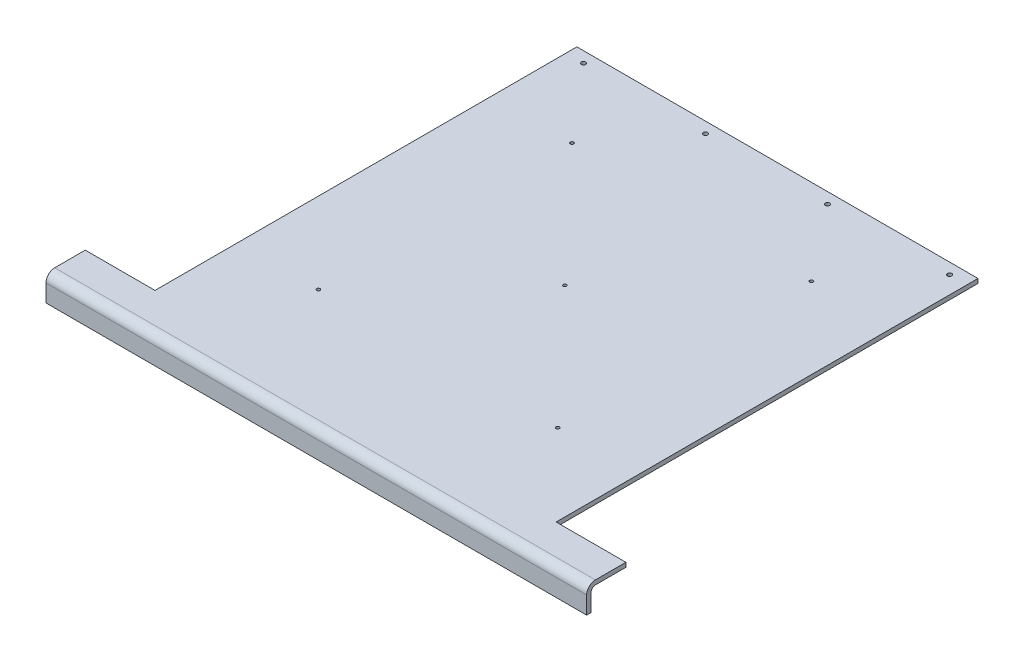
ISO-10303-21;
HEADER;
FILE_DESCRIPTION(('STEP AP214'),'2;1');
FILE_NAME('part.step','',(''),(''),'','','');
FILE_SCHEMA(('AUTOMOTIVE_DESIGN { 1 0 10303 214 1 1 1 1 }'));
ENDSEC;
DATA;
#1=APPLICATION_CONTEXT('core data for automotive mechanical design processes');
#2=APPLICATION_PROTOCOL_DEFINITION('international standard','automotive_design',2000,#1);
#3=PRODUCT_CONTEXT('',#1,'mechanical');
#4=PRODUCT('Part','Part','',(#3));
#5=PRODUCT_RELATED_PRODUCT_CATEGORY('part','',(#4));
#6=PRODUCT_DEFINITION_FORMATION('','',#4);
#7=PRODUCT_DEFINITION_CONTEXT('part definition',#1,'design');
#8=PRODUCT_DEFINITION('design','',#6,#7);
#9=PRODUCT_DEFINITION_SHAPE('','',#8);
#10=(LENGTH_UNIT() NAMED_UNIT(*) SI_UNIT(.MILLI.,.METRE.));
#11=(NAMED_UNIT(*) PLANE_ANGLE_UNIT() SI_UNIT($,.RADIAN.));
#12=(NAMED_UNIT(*) SI_UNIT($,.STERADIAN.) SOLID_ANGLE_UNIT());
#13=UNCERTAINTY_MEASURE_WITH_UNIT(LENGTH_MEASURE(1.E-05),#10,'distance_accuracy_value','');
#14=(GEOMETRIC_REPRESENTATION_CONTEXT(3) GLOBAL_UNCERTAINTY_ASSIGNED_CONTEXT((#13)) GLOBAL_UNIT_ASSIGNED_CONTEXT((#10,
#11,#12)) REPRESENTATION_CONTEXT('',''));
#15=CARTESIAN_POINT('',(0.,0.,0.));
#16=DIRECTION('',(0.,0.,1.));
#17=DIRECTION('',(1.,0.,0.));
#18=AXIS2_PLACEMENT_3D('',#15,#16,#17);
#19=CARTESIAN_POINT('',(-393.7,6.35,671.5252));
#20=DIRECTION('',(0.,0.,1.));
#21=DIRECTION('',(1.,0.,0.));
#22=AXIS2_PLACEMENT_3D('',#19,#20,#21);
#23=PLANE('',#22);
#24=DIRECTION('',(-1.,0.,0.));
#25=VECTOR('',#24,1.);
#26=CARTESIAN_POINT('',(393.7,-6.35,671.5252));
#27=LINE('',#26,#25);
#28=CARTESIAN_POINT('',(-393.7,-6.35,671.5252));
#29=VERTEX_POINT('',#28);
#30=CARTESIAN_POINT('',(393.7,-6.35,671.5252));
#31=VERTEX_POINT('',#30);
#32=EDGE_CURVE('E176',#29,#31,#27,.F.);
#33=ORIENTED_EDGE('',*,*,#32,.F.);
#34=DIRECTION('',(0.,1.,0.));
#35=VECTOR('',#34,1.);
#36=CARTESIAN_POINT('',(-393.7,-19.05,671.5252));
#37=LINE('',#36,#35);
#38=CARTESIAN_POINT('',(-393.7,-31.75,671.5252));
#39=VERTEX_POINT('',#38);
#40=EDGE_CURVE('E111',#39,#29,#37,.T.);
#41=ORIENTED_EDGE('',*,*,#40,.F.);
#42=DIRECTION('',(1.,0.,0.));
#43=VECTOR('',#42,1.);
#44=CARTESIAN_POINT('',(0.,-31.75,671.5252));
#45=LINE('',#44,#43);
#46=CARTESIAN_POINT('',(393.7,-31.75,671.5252));
#47=VERTEX_POINT('',#46);
#48=EDGE_CURVE('E198',#47,#39,#45,.F.);
#49=ORIENTED_EDGE('',*,*,#48,.F.);
#50=DIRECTION('',(0.,1.,0.));
#51=VECTOR('',#50,1.);
#52=CARTESIAN_POINT('',(393.7,-19.05,671.5252));
#53=LINE('',#52,#51);
#54=EDGE_CURVE('E179',#31,#47,#53,.F.);
#55=ORIENTED_EDGE('',*,*,#54,.F.);
#56=EDGE_LOOP('',(#33,#41,#49,#55));
#57=FACE_BOUND('',#56,.T.);
#58=ADVANCED_FACE('F16',(#57),#23,.T.);
#59=CARTESIAN_POINT('',(0.,-31.75,668.3502));
#60=DIRECTION('',(0.,-1.,0.));
#61=DIRECTION('',(0.,0.,-1.));
#62=AXIS2_PLACEMENT_3D('',#59,#60,#61);
#63=PLANE('',#62);
#64=DIRECTION('',(0.,0.,-1.));
#65=VECTOR('',#64,1.);
#66=CARTESIAN_POINT('',(393.7,-31.75,668.3502));
#67=LINE('',#66,#65);
#68=CARTESIAN_POINT('',(393.7,-31.75,665.1752));
#69=VERTEX_POINT('',#68);
#70=EDGE_CURVE('E182',#47,#69,#67,.T.);
#71=ORIENTED_EDGE('',*,*,#70,.F.);
#72=ORIENTED_EDGE('',*,*,#48,.T.);
#73=DIRECTION('',(0.,0.,1.));
#74=VECTOR('',#73,1.);
#75=CARTESIAN_POINT('',(-393.7,-31.75,668.3502));
#76=LINE('',#75,#74);
#77=CARTESIAN_POINT('',(-393.7,-31.75,665.1752));
#78=VERTEX_POINT('',#77);
#79=EDGE_CURVE('E186',#78,#39,#76,.T.);
#80=ORIENTED_EDGE('',*,*,#79,.F.);
#81=DIRECTION('',(1.,0.,0.));
#82=VECTOR('',#81,1.);
#83=CARTESIAN_POINT('',(-393.7,-31.75,665.1752));
#84=LINE('',#83,#82);
#85=EDGE_CURVE('E192',#78,#69,#84,.T.);
#86=ORIENTED_EDGE('',*,*,#85,.T.);
#87=EDGE_LOOP('',(#71,#72,#80,#86));
#88=FACE_BOUND('',#87,.T.);
#89=ADVANCED_FACE('F516',(#88),#63,.T.);
#90=CARTESIAN_POINT('',(393.7,-6.35,658.8252));
#91=DIRECTION('',(-1.,0.,0.));
#92=DIRECTION('',(0.,0.,1.));
#93=AXIS2_PLACEMENT_3D('',#90,#91,#92);
#94=CYLINDRICAL_SURFACE('',#93,12.7);
#95=CARTESIAN_POINT('',(-393.7,-6.35,658.8252));
#96=DIRECTION('',(-1.,0.,0.));
#97=DIRECTION('',(0.,0.,1.));
#98=AXIS2_PLACEMENT_3D('',#95,#96,#97);
#99=CIRCLE('',#98,12.7);
#100=CARTESIAN_POINT('',(-393.7,6.35,658.8252));
#101=VERTEX_POINT('',#100);
#102=EDGE_CURVE('E19',#101,#29,#99,.F.);
#103=ORIENTED_EDGE('',*,*,#102,.T.);
#104=ORIENTED_EDGE('',*,*,#32,.T.);
#105=CARTESIAN_POINT('',(393.7,-6.35,658.8252));
#106=DIRECTION('',(-1.,0.,0.));
#107=DIRECTION('',(0.,0.,1.));
#108=AXIS2_PLACEMENT_3D('',#105,#106,#107);
#109=CIRCLE('',#108,12.7);
#110=CARTESIAN_POINT('',(393.7,6.35,658.8252));
#111=VERTEX_POINT('',#110);
#112=EDGE_CURVE('E114',#111,#31,#109,.F.);
#113=ORIENTED_EDGE('',*,*,#112,.F.);
#114=DIRECTION('',(1.,0.,0.));
#115=VECTOR('',#114,1.);
#116=CARTESIAN_POINT('',(0.,6.35,658.8252));
#117=LINE('',#116,#115);
#118=EDGE_CURVE('E117',#101,#111,#117,.T.);
#119=ORIENTED_EDGE('',*,*,#118,.F.);
#120=EDGE_LOOP('',(#103,#104,#113,#119));
#121=FACE_BOUND('',#120,.T.);
#122=ADVANCED_FACE('F118',(#121),#94,.T.);
#123=CARTESIAN_POINT('',(-393.7,6.35,665.1752));
#124=DIRECTION('',(0.,0.,1.));
#125=DIRECTION('',(1.,0.,0.));
#126=AXIS2_PLACEMENT_3D('',#123,#124,#125);
#127=PLANE('',#126);
#128=DIRECTION('',(0.,1.,0.));
#129=VECTOR('',#128,1.);
#130=CARTESIAN_POINT('',(393.7,6.35,665.1752));
#131=LINE('',#130,#129);
#132=CARTESIAN_POINT('',(393.7,-6.35,665.1752));
#133=VERTEX_POINT('',#132);
#134=EDGE_CURVE('E115',#69,#133,#131,.T.);
#135=ORIENTED_EDGE('',*,*,#134,.F.);
#136=ORIENTED_EDGE('',*,*,#85,.F.);
#137=DIRECTION('',(0.,1.,0.));
#138=VECTOR('',#137,1.);
#139=CARTESIAN_POINT('',(-393.7,6.35,665.1752));
#140=LINE('',#139,#138);
#141=CARTESIAN_POINT('',(-393.7,-6.35,665.1752));
#142=VERTEX_POINT('',#141);
#143=EDGE_CURVE('E178',#142,#78,#140,.F.);
#144=ORIENTED_EDGE('',*,*,#143,.F.);
#145=DIRECTION('',(-1.,0.,0.));
#146=VECTOR('',#145,1.);
#147=CARTESIAN_POINT('',(393.7,-6.35,665.1752));
#148=LINE('',#147,#146);
#149=EDGE_CURVE('E128',#142,#133,#148,.F.);
#150=ORIENTED_EDGE('',*,*,#149,.T.);
#151=EDGE_LOOP('',(#135,#136,#144,#150));
#152=FACE_BOUND('',#151,.T.);
#153=ADVANCED_FACE('F289',(#152),#127,.F.);
#154=CARTESIAN_POINT('',(0.,6.35,0.));
#155=DIRECTION('',(0.,1.,0.));
#156=DIRECTION('',(0.,0.,1.));
#157=AXIS2_PLACEMENT_3D('',#154,#155,#156);
#158=PLANE('',#157);
#159=CARTESIAN_POINT('',(0.,6.35,309.5752));
#160=DIRECTION('',(0.,1.,0.));
#161=DIRECTION('',(0.,0.,1.));
#162=AXIS2_PLACEMENT_3D('',#159,#160,#161);
#163=CIRCLE('',#162,2.4257);
#164=CARTESIAN_POINT('',(0.,6.35,312.0009));
#165=VERTEX_POINT('',#164);
#166=EDGE_CURVE('E239',#165,#165,#163,.F.);
#167=ORIENTED_EDGE('',*,*,#166,.T.);
#168=EDGE_LOOP('',(#167));
#169=FACE_BOUND('',#168,.T.);
#170=CARTESIAN_POINT('',(-174.315119987351,6.35,124.83148848646));
#171=DIRECTION('',(0.,1.,0.));
#172=DIRECTION('',(0.,0.,1.));
#173=AXIS2_PLACEMENT_3D('',#170,#171,#172);
#174=CIRCLE('',#173,2.4257);
#175=CARTESIAN_POINT('',(-174.315119987351,6.35,127.25718848646));
#176=VERTEX_POINT('',#175);
#177=EDGE_CURVE('E236',#176,#176,#174,.F.);
#178=ORIENTED_EDGE('',*,*,#177,.T.);
#179=EDGE_LOOP('',(#178));
#180=FACE_BOUND('',#179,.T.);
#181=CARTESIAN_POINT('',(174.315119987351,6.35,494.318911513616));
#182=DIRECTION('',(0.,1.,0.));
#183=DIRECTION('',(0.,0.,1.));
#184=AXIS2_PLACEMENT_3D('',#181,#182,#183);
#185=CIRCLE('',#184,2.4257);
#186=CARTESIAN_POINT('',(174.315119987351,6.35,496.744611513616));
#187=VERTEX_POINT('',#186);
#188=EDGE_CURVE('E233',#187,#187,#185,.F.);
#189=ORIENTED_EDGE('',*,*,#188,.T.);
#190=EDGE_LOOP('',(#189));
#191=FACE_BOUND('',#190,.T.);
#192=CARTESIAN_POINT('',(174.315119987351,6.35,124.83148848646));
#193=DIRECTION('',(0.,1.,0.));
#194=DIRECTION('',(0.,0.,1.));
#195=AXIS2_PLACEMENT_3D('',#192,#193,#194);
#196=CIRCLE('',#195,2.4257);
#197=CARTESIAN_POINT('',(174.315119987351,6.35,127.25718848646));
#198=VERTEX_POINT('',#197);
#199=EDGE_CURVE('E230',#198,#198,#196,.F.);
#200=ORIENTED_EDGE('',*,*,#199,.T.);
#201=EDGE_LOOP('',(#200));
#202=FACE_BOUND('',#201,.T.);
#203=CARTESIAN_POINT('',(-174.315119987351,6.35,494.318911513616));
#204=DIRECTION('',(0.,1.,0.));
#205=DIRECTION('',(0.,0.,1.));
#206=AXIS2_PLACEMENT_3D('',#203,#204,#205);
#207=CIRCLE('',#206,2.4257);
#208=CARTESIAN_POINT('',(-174.315119987351,6.35,496.744611513616));
#209=VERTEX_POINT('',#208);
#210=EDGE_CURVE('E163',#209,#209,#207,.F.);
#211=ORIENTED_EDGE('',*,*,#210,.T.);
#212=EDGE_LOOP('',(#211));
#213=FACE_BOUND('',#212,.T.);
#214=CARTESIAN_POINT('',(-266.7,6.35,15.875));
#215=DIRECTION('',(0.,1.,0.));
#216=DIRECTION('',(0.,0.,1.));
#217=AXIS2_PLACEMENT_3D('',#214,#215,#216);
#218=CIRCLE('',#217,3.175);
#219=CARTESIAN_POINT('',(-266.7,6.35,19.05));
#220=VERTEX_POINT('',#219);
#221=EDGE_CURVE('E169',#220,#220,#218,.F.);
#222=ORIENTED_EDGE('',*,*,#221,.T.);
#223=EDGE_LOOP('',(#222));
#224=FACE_BOUND('',#223,.T.);
#225=CARTESIAN_POINT('',(-88.9,6.35,15.875));
#226=DIRECTION('',(0.,1.,0.));
#227=DIRECTION('',(0.,0.,1.));
#228=AXIS2_PLACEMENT_3D('',#225,#226,#227);
#229=CIRCLE('',#228,3.175);
#230=CARTESIAN_POINT('',(-88.9,6.35,19.05));
#231=VERTEX_POINT('',#230);
#232=EDGE_CURVE('E248',#231,#231,#229,.F.);
#233=ORIENTED_EDGE('',*,*,#232,.T.);
#234=EDGE_LOOP('',(#233));
#235=FACE_BOUND('',#234,.T.);
#236=CARTESIAN_POINT('',(88.9,6.35,15.875));
#237=DIRECTION('',(0.,1.,0.));
#238=DIRECTION('',(0.,0.,1.));
#239=AXIS2_PLACEMENT_3D('',#236,#237,#238);
#240=CIRCLE('',#239,3.175);
#241=CARTESIAN_POINT('',(88.9,6.35,19.05));
#242=VERTEX_POINT('',#241);
#243=EDGE_CURVE('E245',#242,#242,#240,.F.);
#244=ORIENTED_EDGE('',*,*,#243,.T.);
#245=EDGE_LOOP('',(#244));
#246=FACE_BOUND('',#245,.T.);
#247=CARTESIAN_POINT('',(266.7,6.35,15.875));
#248=DIRECTION('',(0.,1.,0.));
#249=DIRECTION('',(0.,0.,1.));
#250=AXIS2_PLACEMENT_3D('',#247,#248,#249);
#251=CIRCLE('',#250,3.175);
#252=CARTESIAN_POINT('',(266.7,6.35,19.05));
#253=VERTEX_POINT('',#252);
#254=EDGE_CURVE('E242',#253,#253,#251,.F.);
#255=ORIENTED_EDGE('',*,*,#254,.T.);
#256=EDGE_LOOP('',(#255));
#257=FACE_BOUND('',#256,.T.);
#258=DIRECTION('',(1.,0.,0.));
#259=VECTOR('',#258,1.);
#260=CARTESIAN_POINT('',(0.,6.35,0.));
#261=LINE('',#260,#259);
#262=CARTESIAN_POINT('',(292.1,6.35,0.));
#263=VERTEX_POINT('',#262);
#264=CARTESIAN_POINT('',(-292.1,6.35,0.));
#265=VERTEX_POINT('',#264);
#266=EDGE_CURVE('E170',#263,#265,#261,.F.);
#267=ORIENTED_EDGE('',*,*,#266,.T.);
#268=DIRECTION('',(0.,0.,-1.));
#269=VECTOR('',#268,1.);
#270=CARTESIAN_POINT('',(-292.1,6.35,307.1876));
#271=LINE('',#270,#269);
#272=CARTESIAN_POINT('',(-292.1,6.35,614.3752));
#273=VERTEX_POINT('',#272);
#274=EDGE_CURVE('E122',#265,#273,#271,.F.);
#275=ORIENTED_EDGE('',*,*,#274,.T.);
#276=DIRECTION('',(1.,0.,0.));
#277=VECTOR('',#276,1.);
#278=CARTESIAN_POINT('',(-342.9,6.35,614.3752));
#279=LINE('',#278,#277);
#280=CARTESIAN_POINT('',(-393.7,6.35,614.3752));
#281=VERTEX_POINT('',#280);
#282=EDGE_CURVE('E127',#273,#281,#279,.F.);
#283=ORIENTED_EDGE('',*,*,#282,.T.);
#284=DIRECTION('',(0.,0.,-1.));
#285=VECTOR('',#284,1.);
#286=CARTESIAN_POINT('',(-393.7,6.35,642.9502));
#287=LINE('',#286,#285);
#288=EDGE_CURVE('E107',#281,#101,#287,.F.);
#289=ORIENTED_EDGE('',*,*,#288,.T.);
#290=ORIENTED_EDGE('',*,*,#118,.T.);
#291=DIRECTION('',(0.,0.,1.));
#292=VECTOR('',#291,1.);
#293=CARTESIAN_POINT('',(393.7,6.35,642.9502));
#294=LINE('',#293,#292);
#295=CARTESIAN_POINT('',(393.7,6.35,614.3752));
#296=VERTEX_POINT('',#295);
#297=EDGE_CURVE('E256',#111,#296,#294,.F.);
#298=ORIENTED_EDGE('',*,*,#297,.T.);
#299=DIRECTION('',(1.,0.,0.));
#300=VECTOR('',#299,1.);
#301=CARTESIAN_POINT('',(342.9,6.35,614.3752));
#302=LINE('',#301,#300);
#303=CARTESIAN_POINT('',(292.1,6.35,614.3752));
#304=VERTEX_POINT('',#303);
#305=EDGE_CURVE('E266',#296,#304,#302,.F.);
#306=ORIENTED_EDGE('',*,*,#305,.T.);
#307=DIRECTION('',(0.,0.,1.));
#308=VECTOR('',#307,1.);
#309=CARTESIAN_POINT('',(292.1,6.35,307.1876));
#310=LINE('',#309,#308);
#311=EDGE_CURVE('E306',#304,#263,#310,.F.);
#312=ORIENTED_EDGE('',*,*,#311,.T.);
#313=EDGE_LOOP('',(#267,#275,#283,#289,#290,#298,#306,#312));
#314=FACE_BOUND('',#313,.T.);
#315=ADVANCED_FACE('F125',(#169,#180,#191,#202,#213,#224,#235,#246,#257,#314),#158,.T.);
#316=CARTESIAN_POINT('',(-292.1,3.175,307.1876));
#317=DIRECTION('',(1.,0.,0.));
#318=DIRECTION('',(0.,0.,-1.));
#319=AXIS2_PLACEMENT_3D('',#316,#317,#318);
#320=PLANE('',#319);
#321=ORIENTED_EDGE('',*,*,#274,.F.);
#322=DIRECTION('',(0.,1.,0.));
#323=VECTOR('',#322,1.);
#324=CARTESIAN_POINT('',(-292.1,3.175,0.));
#325=LINE('',#324,#323);
#326=CARTESIAN_POINT('',(-292.1,0.,0.));
#327=VERTEX_POINT('',#326);
#328=EDGE_CURVE('E166',#265,#327,#325,.F.);
#329=ORIENTED_EDGE('',*,*,#328,.T.);
#330=DIRECTION('',(0.,0.,1.));
#331=VECTOR('',#330,1.);
#332=CARTESIAN_POINT('',(-292.1,0.,0.));
#333=LINE('',#332,#331);
#334=CARTESIAN_POINT('',(-292.1,0.,614.3752));
#335=VERTEX_POINT('',#334);
#336=EDGE_CURVE('E151',#327,#335,#333,.T.);
#337=ORIENTED_EDGE('',*,*,#336,.T.);
#338=DIRECTION('',(0.,1.,0.));
#339=VECTOR('',#338,1.);
#340=CARTESIAN_POINT('',(-292.1,3.175,614.3752));
#341=LINE('',#340,#339);
#342=EDGE_CURVE('E144',#335,#273,#341,.T.);
#343=ORIENTED_EDGE('',*,*,#342,.T.);
#344=EDGE_LOOP('',(#321,#329,#337,#343));
#345=FACE_BOUND('',#344,.T.);
#346=ADVANCED_FACE('F321',(#345),#320,.F.);
#347=CARTESIAN_POINT('',(-342.9,3.175,614.3752));
#348=DIRECTION('',(0.,0.,1.));
#349=DIRECTION('',(1.,0.,0.));
#350=AXIS2_PLACEMENT_3D('',#347,#348,#349);
#351=PLANE('',#350);
#352=ORIENTED_EDGE('',*,*,#282,.F.);
#353=ORIENTED_EDGE('',*,*,#342,.F.);
#354=DIRECTION('',(1.,0.,0.));
#355=VECTOR('',#354,1.);
#356=CARTESIAN_POINT('',(0.,0.,614.3752));
#357=LINE('',#356,#355);
#358=CARTESIAN_POINT('',(-393.7,0.,614.3752));
#359=VERTEX_POINT('',#358);
#360=EDGE_CURVE('E147',#335,#359,#357,.F.);
#361=ORIENTED_EDGE('',*,*,#360,.T.);
#362=DIRECTION('',(0.,1.,0.));
#363=VECTOR('',#362,1.);
#364=CARTESIAN_POINT('',(-393.7,3.175,614.3752));
#365=LINE('',#364,#363);
#366=EDGE_CURVE('E129',#359,#281,#365,.T.);
#367=ORIENTED_EDGE('',*,*,#366,.T.);
#368=EDGE_LOOP('',(#352,#353,#361,#367));
#369=FACE_BOUND('',#368,.T.);
#370=ADVANCED_FACE('F320',(#369),#351,.F.);
#371=CARTESIAN_POINT('',(-393.7,3.175,642.9502));
#372=DIRECTION('',(1.,0.,0.));
#373=DIRECTION('',(0.,0.,-1.));
#374=AXIS2_PLACEMENT_3D('',#371,#372,#373);
#375=PLANE('',#374);
#376=ORIENTED_EDGE('',*,*,#288,.F.);
#377=ORIENTED_EDGE('',*,*,#366,.F.);
#378=DIRECTION('',(0.,0.,1.));
#379=VECTOR('',#378,1.);
#380=CARTESIAN_POINT('',(-393.7,0.,0.));
#381=LINE('',#380,#379);
#382=CARTESIAN_POINT('',(-393.7,0.,658.8252));
#383=VERTEX_POINT('',#382);
#384=EDGE_CURVE('E150',#359,#383,#381,.T.);
#385=ORIENTED_EDGE('',*,*,#384,.T.);
#386=CARTESIAN_POINT('',(-393.7,-6.35,658.8252));
#387=DIRECTION('',(-1.,0.,0.));
#388=DIRECTION('',(0.,0.,1.));
#389=AXIS2_PLACEMENT_3D('',#386,#387,#388);
#390=CIRCLE('',#389,6.35);
#391=EDGE_CURVE('E253',#383,#142,#390,.F.);
#392=ORIENTED_EDGE('',*,*,#391,.T.);
#393=ORIENTED_EDGE('',*,*,#143,.T.);
#394=ORIENTED_EDGE('',*,*,#79,.T.);
#395=ORIENTED_EDGE('',*,*,#40,.T.);
#396=ORIENTED_EDGE('',*,*,#102,.F.);
#397=EDGE_LOOP('',(#376,#377,#385,#392,#393,#394,#395,#396));
#398=FACE_BOUND('',#397,.T.);
#399=ADVANCED_FACE('F105',(#398),#375,.F.);
#400=CARTESIAN_POINT('',(393.7,-6.35,658.8252));
#401=DIRECTION('',(-1.,0.,0.));
#402=DIRECTION('',(0.,0.,1.));
#403=AXIS2_PLACEMENT_3D('',#400,#401,#402);
#404=CYLINDRICAL_SURFACE('',#403,6.35);
#405=DIRECTION('',(1.,0.,0.));
#406=VECTOR('',#405,1.);
#407=CARTESIAN_POINT('',(0.,0.,658.8252));
#408=LINE('',#407,#406);
#409=CARTESIAN_POINT('',(393.7,0.,658.8252));
#410=VERTEX_POINT('',#409);
#411=EDGE_CURVE('E269',#383,#410,#408,.T.);
#412=ORIENTED_EDGE('',*,*,#411,.T.);
#413=CARTESIAN_POINT('',(393.7,-6.35,658.8252));
#414=DIRECTION('',(-1.,0.,0.));
#415=DIRECTION('',(0.,0.,1.));
#416=AXIS2_PLACEMENT_3D('',#413,#414,#415);
#417=CIRCLE('',#416,6.35);
#418=EDGE_CURVE('E132',#133,#410,#417,.T.);
#419=ORIENTED_EDGE('',*,*,#418,.F.);
#420=ORIENTED_EDGE('',*,*,#149,.F.);
#421=ORIENTED_EDGE('',*,*,#391,.F.);
#422=EDGE_LOOP('',(#412,#419,#420,#421));
#423=FACE_BOUND('',#422,.T.);
#424=ADVANCED_FACE('F287',(#423),#404,.F.);
#425=CARTESIAN_POINT('',(393.7,3.175,642.9502));
#426=DIRECTION('',(-1.,0.,0.));
#427=DIRECTION('',(0.,0.,1.));
#428=AXIS2_PLACEMENT_3D('',#425,#426,#427);
#429=PLANE('',#428);
#430=ORIENTED_EDGE('',*,*,#297,.F.);
#431=ORIENTED_EDGE('',*,*,#112,.T.);
#432=ORIENTED_EDGE('',*,*,#54,.T.);
#433=ORIENTED_EDGE('',*,*,#70,.T.);
#434=ORIENTED_EDGE('',*,*,#134,.T.);
#435=ORIENTED_EDGE('',*,*,#418,.T.);
#436=DIRECTION('',(0.,0.,1.));
#437=VECTOR('',#436,1.);
#438=CARTESIAN_POINT('',(393.7,0.,0.));
#439=LINE('',#438,#437);
#440=CARTESIAN_POINT('',(393.7,0.,614.3752));
#441=VERTEX_POINT('',#440);
#442=EDGE_CURVE('E296',#410,#441,#439,.F.);
#443=ORIENTED_EDGE('',*,*,#442,.T.);
#444=DIRECTION('',(0.,1.,0.));
#445=VECTOR('',#444,1.);
#446=CARTESIAN_POINT('',(393.7,3.175,614.3752));
#447=LINE('',#446,#445);
#448=EDGE_CURVE('E263',#441,#296,#447,.T.);
#449=ORIENTED_EDGE('',*,*,#448,.T.);
#450=EDGE_LOOP('',(#430,#431,#432,#433,#434,#435,#443,#449));
#451=FACE_BOUND('',#450,.T.);
#452=ADVANCED_FACE('F258',(#451),#429,.F.);
#453=CARTESIAN_POINT('',(342.9,3.175,614.3752));
#454=DIRECTION('',(0.,0.,1.));
#455=DIRECTION('',(1.,0.,0.));
#456=AXIS2_PLACEMENT_3D('',#453,#454,#455);
#457=PLANE('',#456);
#458=ORIENTED_EDGE('',*,*,#305,.F.);
#459=ORIENTED_EDGE('',*,*,#448,.F.);
#460=DIRECTION('',(1.,0.,0.));
#461=VECTOR('',#460,1.);
#462=CARTESIAN_POINT('',(0.,0.,614.3752));
#463=LINE('',#462,#461);
#464=CARTESIAN_POINT('',(292.1,0.,614.3752));
#465=VERTEX_POINT('',#464);
#466=EDGE_CURVE('E297',#441,#465,#463,.F.);
#467=ORIENTED_EDGE('',*,*,#466,.T.);
#468=DIRECTION('',(0.,1.,0.));
#469=VECTOR('',#468,1.);
#470=CARTESIAN_POINT('',(292.1,3.175,614.3752));
#471=LINE('',#470,#469);
#472=EDGE_CURVE('E303',#465,#304,#471,.T.);
#473=ORIENTED_EDGE('',*,*,#472,.T.);
#474=EDGE_LOOP('',(#458,#459,#467,#473));
#475=FACE_BOUND('',#474,.T.);
#476=ADVANCED_FACE('F317',(#475),#457,.F.);
#477=CARTESIAN_POINT('',(292.1,3.175,307.1876));
#478=DIRECTION('',(-1.,0.,0.));
#479=DIRECTION('',(0.,0.,1.));
#480=AXIS2_PLACEMENT_3D('',#477,#478,#479);
#481=PLANE('',#480);
#482=ORIENTED_EDGE('',*,*,#311,.F.);
#483=ORIENTED_EDGE('',*,*,#472,.F.);
#484=DIRECTION('',(0.,0.,1.));
#485=VECTOR('',#484,1.);
#486=CARTESIAN_POINT('',(292.1,0.,0.));
#487=LINE('',#486,#485);
#488=CARTESIAN_POINT('',(292.1,0.,0.));
#489=VERTEX_POINT('',#488);
#490=EDGE_CURVE('E299',#465,#489,#487,.F.);
#491=ORIENTED_EDGE('',*,*,#490,.T.);
#492=DIRECTION('',(0.,1.,0.));
#493=VECTOR('',#492,1.);
#494=CARTESIAN_POINT('',(292.1,3.175,0.));
#495=LINE('',#494,#493);
#496=EDGE_CURVE('E34',#489,#263,#495,.T.);
#497=ORIENTED_EDGE('',*,*,#496,.T.);
#498=EDGE_LOOP('',(#482,#483,#491,#497));
#499=FACE_BOUND('',#498,.T.);
#500=ADVANCED_FACE('F315',(#499),#481,.F.);
#501=CARTESIAN_POINT('',(0.,3.175,0.));
#502=DIRECTION('',(0.,0.,1.));
#503=DIRECTION('',(1.,0.,0.));
#504=AXIS2_PLACEMENT_3D('',#501,#502,#503);
#505=PLANE('',#504);
#506=ORIENTED_EDGE('',*,*,#266,.F.);
#507=ORIENTED_EDGE('',*,*,#496,.F.);
#508=DIRECTION('',(1.,0.,0.));
#509=VECTOR('',#508,1.);
#510=CARTESIAN_POINT('',(0.,0.,0.));
#511=LINE('',#510,#509);
#512=EDGE_CURVE('E227',#489,#327,#511,.F.);
#513=ORIENTED_EDGE('',*,*,#512,.T.);
#514=ORIENTED_EDGE('',*,*,#328,.F.);
#515=EDGE_LOOP('',(#506,#507,#513,#514));
#516=FACE_BOUND('',#515,.T.);
#517=ADVANCED_FACE('F312',(#516),#505,.F.);
#518=CARTESIAN_POINT('',(-266.7,3.175,15.875));
#519=DIRECTION('',(0.,1.,0.));
#520=DIRECTION('',(0.,0.,1.));
#521=AXIS2_PLACEMENT_3D('',#518,#519,#520);
#522=CYLINDRICAL_SURFACE('',#521,3.175);
#523=ORIENTED_EDGE('',*,*,#221,.F.);
#524=EDGE_LOOP('',(#523));
#525=FACE_BOUND('',#524,.T.);
#526=CARTESIAN_POINT('',(-266.7,0.,15.875));
#527=DIRECTION('',(0.,1.,0.));
#528=DIRECTION('',(0.,0.,1.));
#529=AXIS2_PLACEMENT_3D('',#526,#527,#528);
#530=CIRCLE('',#529,3.175);
#531=CARTESIAN_POINT('',(-266.7,0.,19.05));
#532=VERTEX_POINT('',#531);
#533=EDGE_CURVE('E224',#532,#532,#530,.F.);
#534=ORIENTED_EDGE('',*,*,#533,.T.);
#535=EDGE_LOOP('',(#534));
#536=FACE_BOUND('',#535,.T.);
#537=ADVANCED_FACE('F371',(#525,#536),#522,.F.);
#538=CARTESIAN_POINT('',(-88.9,3.175,15.875));
#539=DIRECTION('',(0.,1.,0.));
#540=DIRECTION('',(0.,0.,1.));
#541=AXIS2_PLACEMENT_3D('',#538,#539,#540);
#542=CYLINDRICAL_SURFACE('',#541,3.175);
#543=ORIENTED_EDGE('',*,*,#232,.F.);
#544=EDGE_LOOP('',(#543));
#545=FACE_BOUND('',#544,.T.);
#546=CARTESIAN_POINT('',(-88.9,0.,15.875));
#547=DIRECTION('',(0.,1.,0.));
#548=DIRECTION('',(0.,0.,1.));
#549=AXIS2_PLACEMENT_3D('',#546,#547,#548);
#550=CIRCLE('',#549,3.175);
#551=CARTESIAN_POINT('',(-88.9,0.,19.05));
#552=VERTEX_POINT('',#551);
#553=EDGE_CURVE('E221',#552,#552,#550,.F.);
#554=ORIENTED_EDGE('',*,*,#553,.T.);
#555=EDGE_LOOP('',(#554));
#556=FACE_BOUND('',#555,.T.);
#557=ADVANCED_FACE('F367',(#545,#556),#542,.F.);
#558=CARTESIAN_POINT('',(88.9,3.175,15.875));
#559=DIRECTION('',(0.,1.,0.));
#560=DIRECTION('',(0.,0.,1.));
#561=AXIS2_PLACEMENT_3D('',#558,#559,#560);
#562=CYLINDRICAL_SURFACE('',#561,3.175);
#563=ORIENTED_EDGE('',*,*,#243,.F.);
#564=EDGE_LOOP('',(#563));
#565=FACE_BOUND('',#564,.T.);
#566=CARTESIAN_POINT('',(88.9,0.,15.875));
#567=DIRECTION('',(0.,1.,0.));
#568=DIRECTION('',(0.,0.,1.));
#569=AXIS2_PLACEMENT_3D('',#566,#567,#568);
#570=CIRCLE('',#569,3.175);
#571=CARTESIAN_POINT('',(88.9,0.,19.05));
#572=VERTEX_POINT('',#571);
#573=EDGE_CURVE('E218',#572,#572,#570,.F.);
#574=ORIENTED_EDGE('',*,*,#573,.T.);
#575=EDGE_LOOP('',(#574));
#576=FACE_BOUND('',#575,.T.);
#577=ADVANCED_FACE('F363',(#565,#576),#562,.F.);
#578=CARTESIAN_POINT('',(266.7,3.175,15.875));
#579=DIRECTION('',(0.,1.,0.));
#580=DIRECTION('',(0.,0.,1.));
#581=AXIS2_PLACEMENT_3D('',#578,#579,#580);
#582=CYLINDRICAL_SURFACE('',#581,3.175);
#583=ORIENTED_EDGE('',*,*,#254,.F.);
#584=EDGE_LOOP('',(#583));
#585=FACE_BOUND('',#584,.T.);
#586=CARTESIAN_POINT('',(266.7,0.,15.875));
#587=DIRECTION('',(0.,1.,0.));
#588=DIRECTION('',(0.,0.,1.));
#589=AXIS2_PLACEMENT_3D('',#586,#587,#588);
#590=CIRCLE('',#589,3.175);
#591=CARTESIAN_POINT('',(266.7,0.,19.05));
#592=VERTEX_POINT('',#591);
#593=EDGE_CURVE('E215',#592,#592,#590,.F.);
#594=ORIENTED_EDGE('',*,*,#593,.T.);
#595=EDGE_LOOP('',(#594));
#596=FACE_BOUND('',#595,.T.);
#597=ADVANCED_FACE('F359',(#585,#596),#582,.F.);
#598=CARTESIAN_POINT('',(0.,3.175,309.5752));
#599=DIRECTION('',(0.,1.,0.));
#600=DIRECTION('',(0.,0.,1.));
#601=AXIS2_PLACEMENT_3D('',#598,#599,#600);
#602=CYLINDRICAL_SURFACE('',#601,2.4257);
#603=ORIENTED_EDGE('',*,*,#166,.F.);
#604=EDGE_LOOP('',(#603));
#605=FACE_BOUND('',#604,.T.);
#606=CARTESIAN_POINT('',(0.,0.,309.5752));
#607=DIRECTION('',(0.,1.,0.));
#608=DIRECTION('',(0.,0.,1.));
#609=AXIS2_PLACEMENT_3D('',#606,#607,#608);
#610=CIRCLE('',#609,2.4257);
#611=CARTESIAN_POINT('',(0.,0.,312.0009));
#612=VERTEX_POINT('',#611);
#613=EDGE_CURVE('E212',#612,#612,#610,.F.);
#614=ORIENTED_EDGE('',*,*,#613,.T.);
#615=EDGE_LOOP('',(#614));
#616=FACE_BOUND('',#615,.T.);
#617=ADVANCED_FACE('F355',(#605,#616),#602,.F.);
#618=CARTESIAN_POINT('',(-174.315119987351,3.175,124.83148848646));
#619=DIRECTION('',(0.,1.,0.));
#620=DIRECTION('',(0.,0.,1.));
#621=AXIS2_PLACEMENT_3D('',#618,#619,#620);
#622=CYLINDRICAL_SURFACE('',#621,2.4257);
#623=ORIENTED_EDGE('',*,*,#177,.F.);
#624=EDGE_LOOP('',(#623));
#625=FACE_BOUND('',#624,.T.);
#626=CARTESIAN_POINT('',(-174.315119987351,0.,124.83148848646));
#627=DIRECTION('',(0.,1.,0.));
#628=DIRECTION('',(0.,0.,1.));
#629=AXIS2_PLACEMENT_3D('',#626,#627,#628);
#630=CIRCLE('',#629,2.4257);
#631=CARTESIAN_POINT('',(-174.315119987351,0.,127.25718848646));
#632=VERTEX_POINT('',#631);
#633=EDGE_CURVE('E209',#632,#632,#630,.F.);
#634=ORIENTED_EDGE('',*,*,#633,.T.);
#635=EDGE_LOOP('',(#634));
#636=FACE_BOUND('',#635,.T.);
#637=ADVANCED_FACE('F351',(#625,#636),#622,.F.);
#638=CARTESIAN_POINT('',(174.315119987351,3.175,494.318911513616));
#639=DIRECTION('',(0.,1.,0.));
#640=DIRECTION('',(0.,0.,1.));
#641=AXIS2_PLACEMENT_3D('',#638,#639,#640);
#642=CYLINDRICAL_SURFACE('',#641,2.4257);
#643=ORIENTED_EDGE('',*,*,#188,.F.);
#644=EDGE_LOOP('',(#643));
#645=FACE_BOUND('',#644,.T.);
#646=CARTESIAN_POINT('',(174.315119987351,0.,494.318911513616));
#647=DIRECTION('',(0.,1.,0.));
#648=DIRECTION('',(0.,0.,1.));
#649=AXIS2_PLACEMENT_3D('',#646,#647,#648);
#650=CIRCLE('',#649,2.4257);
#651=CARTESIAN_POINT('',(174.315119987351,0.,496.744611513616));
#652=VERTEX_POINT('',#651);
#653=EDGE_CURVE('E206',#652,#652,#650,.F.);
#654=ORIENTED_EDGE('',*,*,#653,.T.);
#655=EDGE_LOOP('',(#654));
#656=FACE_BOUND('',#655,.T.);
#657=ADVANCED_FACE('F347',(#645,#656),#642,.F.);
#658=CARTESIAN_POINT('',(174.315119987351,3.175,124.83148848646));
#659=DIRECTION('',(0.,1.,0.));
#660=DIRECTION('',(0.,0.,1.));
#661=AXIS2_PLACEMENT_3D('',#658,#659,#660);
#662=CYLINDRICAL_SURFACE('',#661,2.4257);
#663=ORIENTED_EDGE('',*,*,#199,.F.);
#664=EDGE_LOOP('',(#663));
#665=FACE_BOUND('',#664,.T.);
#666=CARTESIAN_POINT('',(174.315119987351,0.,124.83148848646));
#667=DIRECTION('',(0.,1.,0.));
#668=DIRECTION('',(0.,0.,1.));
#669=AXIS2_PLACEMENT_3D('',#666,#667,#668);
#670=CIRCLE('',#669,2.4257);
#671=CARTESIAN_POINT('',(174.315119987351,0.,127.25718848646));
#672=VERTEX_POINT('',#671);
#673=EDGE_CURVE('E25',#672,#672,#670,.F.);
#674=ORIENTED_EDGE('',*,*,#673,.T.);
#675=EDGE_LOOP('',(#674));
#676=FACE_BOUND('',#675,.T.);
#677=ADVANCED_FACE('F339',(#665,#676),#662,.F.);
#678=CARTESIAN_POINT('',(-174.315119987351,3.175,494.318911513616));
#679=DIRECTION('',(0.,1.,0.));
#680=DIRECTION('',(0.,0.,1.));
#681=AXIS2_PLACEMENT_3D('',#678,#679,#680);
#682=CYLINDRICAL_SURFACE('',#681,2.4257);
#683=ORIENTED_EDGE('',*,*,#210,.F.);
#684=EDGE_LOOP('',(#683));
#685=FACE_BOUND('',#684,.T.);
#686=CARTESIAN_POINT('',(-174.315119987351,0.,494.318911513616));
#687=DIRECTION('',(0.,1.,0.));
#688=DIRECTION('',(0.,0.,1.));
#689=AXIS2_PLACEMENT_3D('',#686,#687,#688);
#690=CIRCLE('',#689,2.4257);
#691=CARTESIAN_POINT('',(-174.315119987351,0.,496.744611513616));
#692=VERTEX_POINT('',#691);
#693=EDGE_CURVE('E11',#692,#692,#690,.F.);
#694=ORIENTED_EDGE('',*,*,#693,.T.);
#695=EDGE_LOOP('',(#694));
#696=FACE_BOUND('',#695,.T.);
#697=ADVANCED_FACE('F333',(#685,#696),#682,.F.);
#698=CARTESIAN_POINT('',(0.,0.,0.));
#699=DIRECTION('',(0.,1.,0.));
#700=DIRECTION('',(0.,0.,1.));
#701=AXIS2_PLACEMENT_3D('',#698,#699,#700);
#702=PLANE('',#701);
#703=ORIENTED_EDGE('',*,*,#693,.F.);
#704=EDGE_LOOP('',(#703));
#705=FACE_BOUND('',#704,.T.);
#706=ORIENTED_EDGE('',*,*,#673,.F.);
#707=EDGE_LOOP('',(#706));
#708=FACE_BOUND('',#707,.T.);
#709=ORIENTED_EDGE('',*,*,#653,.F.);
#710=EDGE_LOOP('',(#709));
#711=FACE_BOUND('',#710,.T.);
#712=ORIENTED_EDGE('',*,*,#633,.F.);
#713=EDGE_LOOP('',(#712));
#714=FACE_BOUND('',#713,.T.);
#715=ORIENTED_EDGE('',*,*,#613,.F.);
#716=EDGE_LOOP('',(#715));
#717=FACE_BOUND('',#716,.T.);
#718=ORIENTED_EDGE('',*,*,#593,.F.);
#719=EDGE_LOOP('',(#718));
#720=FACE_BOUND('',#719,.T.);
#721=ORIENTED_EDGE('',*,*,#573,.F.);
#722=EDGE_LOOP('',(#721));
#723=FACE_BOUND('',#722,.T.);
#724=ORIENTED_EDGE('',*,*,#553,.F.);
#725=EDGE_LOOP('',(#724));
#726=FACE_BOUND('',#725,.T.);
#727=ORIENTED_EDGE('',*,*,#533,.F.);
#728=EDGE_LOOP('',(#727));
#729=FACE_BOUND('',#728,.T.);
#730=ORIENTED_EDGE('',*,*,#490,.F.);
#731=ORIENTED_EDGE('',*,*,#466,.F.);
#732=ORIENTED_EDGE('',*,*,#442,.F.);
#733=ORIENTED_EDGE('',*,*,#411,.F.);
#734=ORIENTED_EDGE('',*,*,#384,.F.);
#735=ORIENTED_EDGE('',*,*,#360,.F.);
#736=ORIENTED_EDGE('',*,*,#336,.F.);
#737=ORIENTED_EDGE('',*,*,#512,.F.);
#738=EDGE_LOOP('',(#730,#731,#732,#733,#734,#735,#736,#737));
#739=FACE_BOUND('',#738,.T.);
#740=ADVANCED_FACE('F293',(#705,#708,#711,#714,#717,#720,#723,#726,#729,#739),#702,.F.);
#741=CLOSED_SHELL('',(#58,#89,#122,#153,#315,#346,#370,#399,#424,#452,#476,#500,#517,#537,#557,
#577,#597,#617,#637,#657,#677,#697,#740));
#742=MANIFOLD_SOLID_BREP('B1',#741);
#743=ADVANCED_BREP_SHAPE_REPRESENTATION('',(#18,#742),#14);
#744=SHAPE_DEFINITION_REPRESENTATION(#9,#743);
ENDSEC;
END-ISO-10303-21;
